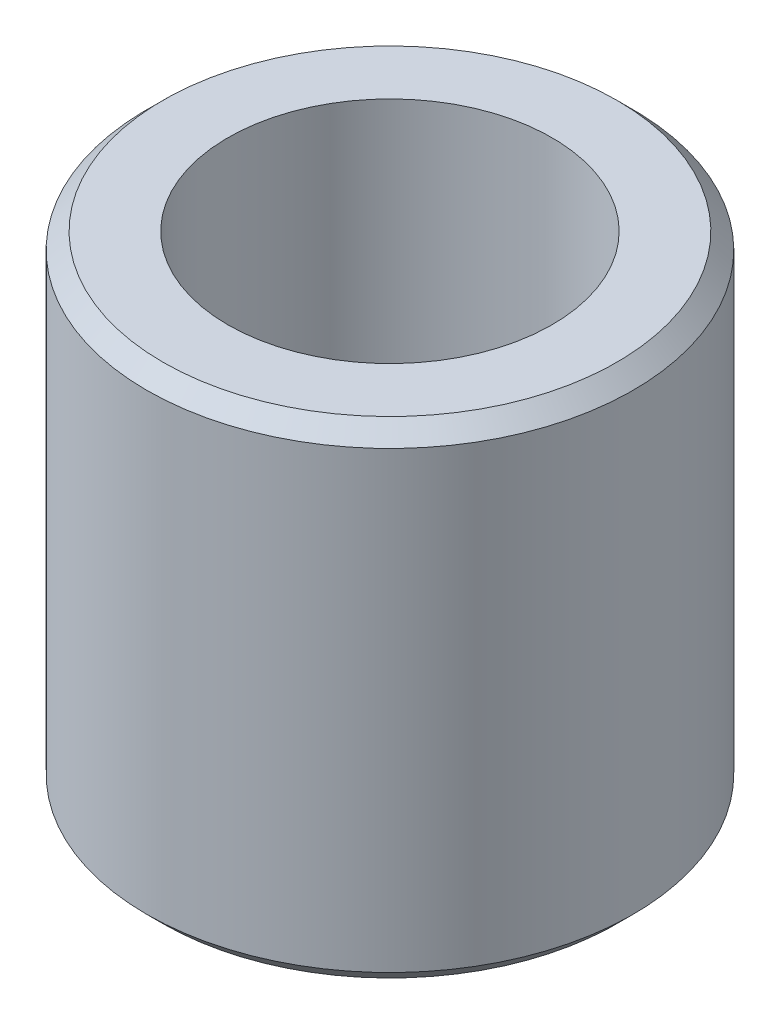
ISO-10303-21;
HEADER;
FILE_DESCRIPTION(('STEP AP214'),'2;1');
FILE_NAME('part.step','',(''),(''),'','','');
FILE_SCHEMA(('AUTOMOTIVE_DESIGN { 1 0 10303 214 1 1 1 1 }'));
ENDSEC;
DATA;
#1=APPLICATION_CONTEXT('core data for automotive mechanical design processes');
#2=APPLICATION_PROTOCOL_DEFINITION('international standard','automotive_design',2000,#1);
#3=PRODUCT_CONTEXT('',#1,'mechanical');
#4=PRODUCT('Part','Part','',(#3));
#5=PRODUCT_RELATED_PRODUCT_CATEGORY('part','',(#4));
#6=PRODUCT_DEFINITION_FORMATION('','',#4);
#7=PRODUCT_DEFINITION_CONTEXT('part definition',#1,'design');
#8=PRODUCT_DEFINITION('design','',#6,#7);
#9=PRODUCT_DEFINITION_SHAPE('','',#8);
#10=(LENGTH_UNIT() NAMED_UNIT(*) SI_UNIT(.MILLI.,.METRE.));
#11=(NAMED_UNIT(*) PLANE_ANGLE_UNIT() SI_UNIT($,.RADIAN.));
#12=(NAMED_UNIT(*) SI_UNIT($,.STERADIAN.) SOLID_ANGLE_UNIT());
#13=UNCERTAINTY_MEASURE_WITH_UNIT(LENGTH_MEASURE(1.E-05),#10,'distance_accuracy_value','');
#14=(GEOMETRIC_REPRESENTATION_CONTEXT(3) GLOBAL_UNCERTAINTY_ASSIGNED_CONTEXT((#13)) GLOBAL_UNIT_ASSIGNED_CONTEXT((#10,
#11,#12)) REPRESENTATION_CONTEXT('',''));
#15=CARTESIAN_POINT('',(0.,0.,0.));
#16=DIRECTION('',(0.,0.,1.));
#17=DIRECTION('',(1.,0.,0.));
#18=AXIS2_PLACEMENT_3D('',#15,#16,#17);
#19=CARTESIAN_POINT('',(0.,15.,0.));
#20=DIRECTION('',(0.,1.,0.));
#21=DIRECTION('',(0.,0.,1.));
#22=AXIS2_PLACEMENT_3D('',#19,#20,#21);
#23=PLANE('',#22);
#24=CARTESIAN_POINT('',(0.,15.,0.));
#25=DIRECTION('',(0.,1.,0.));
#26=DIRECTION('',(0.,0.,1.));
#27=AXIS2_PLACEMENT_3D('',#24,#25,#26);
#28=CIRCLE('',#27,14.);
#29=CARTESIAN_POINT('',(0.,15.,14.));
#30=VERTEX_POINT('',#29);
#31=EDGE_CURVE('E10',#30,#30,#28,.T.);
#32=ORIENTED_EDGE('',*,*,#31,.T.);
#33=EDGE_LOOP('',(#32));
#34=FACE_BOUND('',#33,.T.);
#35=CARTESIAN_POINT('',(0.,15.,0.));
#36=DIRECTION('',(0.,1.,0.));
#37=DIRECTION('',(0.,0.,1.));
#38=AXIS2_PLACEMENT_3D('',#35,#36,#37);
#39=CIRCLE('',#38,10.);
#40=CARTESIAN_POINT('',(0.,15.,10.));
#41=VERTEX_POINT('',#40);
#42=EDGE_CURVE('E70',#41,#41,#39,.T.);
#43=ORIENTED_EDGE('',*,*,#42,.F.);
#44=EDGE_LOOP('',(#43));
#45=FACE_BOUND('',#44,.T.);
#46=ADVANCED_FACE('F45',(#34,#45),#23,.T.);
#47=CARTESIAN_POINT('',(0.,-15.,0.));
#48=DIRECTION('',(0.,1.,0.));
#49=DIRECTION('',(0.,0.,1.));
#50=AXIS2_PLACEMENT_3D('',#47,#48,#49);
#51=PLANE('',#50);
#52=CARTESIAN_POINT('',(0.,-15.,0.));
#53=DIRECTION('',(0.,1.,0.));
#54=DIRECTION('',(0.,0.,1.));
#55=AXIS2_PLACEMENT_3D('',#52,#53,#54);
#56=CIRCLE('',#55,14.);
#57=CARTESIAN_POINT('',(0.,-15.,14.));
#58=VERTEX_POINT('',#57);
#59=EDGE_CURVE('E54',#58,#58,#56,.F.);
#60=ORIENTED_EDGE('',*,*,#59,.T.);
#61=EDGE_LOOP('',(#60));
#62=FACE_BOUND('',#61,.T.);
#63=CARTESIAN_POINT('',(0.,-15.,0.));
#64=DIRECTION('',(0.,1.,0.));
#65=DIRECTION('',(0.,0.,1.));
#66=AXIS2_PLACEMENT_3D('',#63,#64,#65);
#67=CIRCLE('',#66,10.);
#68=CARTESIAN_POINT('',(0.,-15.,10.));
#69=VERTEX_POINT('',#68);
#70=EDGE_CURVE('E71',#69,#69,#67,.T.);
#71=ORIENTED_EDGE('',*,*,#70,.T.);
#72=EDGE_LOOP('',(#71));
#73=FACE_BOUND('',#72,.T.);
#74=ADVANCED_FACE('F83',(#62,#73),#51,.F.);
#75=CARTESIAN_POINT('',(0.,15.,0.));
#76=DIRECTION('',(0.,-1.,0.));
#77=DIRECTION('',(0.,0.,-1.));
#78=AXIS2_PLACEMENT_3D('',#75,#76,#77);
#79=CYLINDRICAL_SURFACE('',#78,15.);
#80=CARTESIAN_POINT('',(0.,-14.,0.));
#81=DIRECTION('',(0.,1.,0.));
#82=DIRECTION('',(0.,0.,1.));
#83=AXIS2_PLACEMENT_3D('',#80,#81,#82);
#84=CIRCLE('',#83,15.);
#85=CARTESIAN_POINT('',(0.,-14.,15.));
#86=VERTEX_POINT('',#85);
#87=EDGE_CURVE('E59',#86,#86,#84,.T.);
#88=ORIENTED_EDGE('',*,*,#87,.T.);
#89=EDGE_LOOP('',(#88));
#90=FACE_BOUND('',#89,.T.);
#91=CARTESIAN_POINT('',(0.,14.,0.));
#92=DIRECTION('',(0.,1.,0.));
#93=DIRECTION('',(0.,0.,1.));
#94=AXIS2_PLACEMENT_3D('',#91,#92,#93);
#95=CIRCLE('',#94,15.);
#96=CARTESIAN_POINT('',(0.,14.,15.));
#97=VERTEX_POINT('',#96);
#98=EDGE_CURVE('E64',#97,#97,#95,.F.);
#99=ORIENTED_EDGE('',*,*,#98,.T.);
#100=EDGE_LOOP('',(#99));
#101=FACE_BOUND('',#100,.T.);
#102=ADVANCED_FACE('F89',(#90,#101),#79,.T.);
#103=CARTESIAN_POINT('',(0.,15.,0.));
#104=DIRECTION('',(0.,-1.,0.));
#105=DIRECTION('',(0.,0.,-1.));
#106=AXIS2_PLACEMENT_3D('',#103,#104,#105);
#107=CYLINDRICAL_SURFACE('',#106,10.);
#108=ORIENTED_EDGE('',*,*,#42,.T.);
#109=EDGE_LOOP('',(#108));
#110=FACE_BOUND('',#109,.T.);
#111=ORIENTED_EDGE('',*,*,#70,.F.);
#112=EDGE_LOOP('',(#111));
#113=FACE_BOUND('',#112,.T.);
#114=ADVANCED_FACE('F79',(#110,#113),#107,.F.);
#115=CARTESIAN_POINT('',(0.,-14.,0.));
#116=DIRECTION('',(0.,1.,0.));
#117=DIRECTION('',(0.,0.,1.));
#118=AXIS2_PLACEMENT_3D('',#115,#116,#117);
#119=CONICAL_SURFACE('',#118,15.,0.785398163397449);
#120=ORIENTED_EDGE('',*,*,#59,.F.);
#121=EDGE_LOOP('',(#120));
#122=FACE_BOUND('',#121,.T.);
#123=ORIENTED_EDGE('',*,*,#87,.F.);
#124=EDGE_LOOP('',(#123));
#125=FACE_BOUND('',#124,.T.);
#126=ADVANCED_FACE('F96',(#122,#125),#119,.T.);
#127=CARTESIAN_POINT('',(0.,15.,0.));
#128=DIRECTION('',(0.,-1.,0.));
#129=DIRECTION('',(0.,0.,-1.));
#130=AXIS2_PLACEMENT_3D('',#127,#128,#129);
#131=CONICAL_SURFACE('',#130,14.,0.785398163397447);
#132=ORIENTED_EDGE('',*,*,#98,.F.);
#133=EDGE_LOOP('',(#132));
#134=FACE_BOUND('',#133,.T.);
#135=ORIENTED_EDGE('',*,*,#31,.F.);
#136=EDGE_LOOP('',(#135));
#137=FACE_BOUND('',#136,.T.);
#138=ADVANCED_FACE('F48',(#134,#137),#131,.T.);
#139=CLOSED_SHELL('',(#46,#74,#102,#114,#126,#138));
#140=MANIFOLD_SOLID_BREP('B2',#139);
#141=ADVANCED_BREP_SHAPE_REPRESENTATION('',(#18,#140),#14);
#142=SHAPE_DEFINITION_REPRESENTATION(#9,#141);
ENDSEC;
END-ISO-10303-21;
